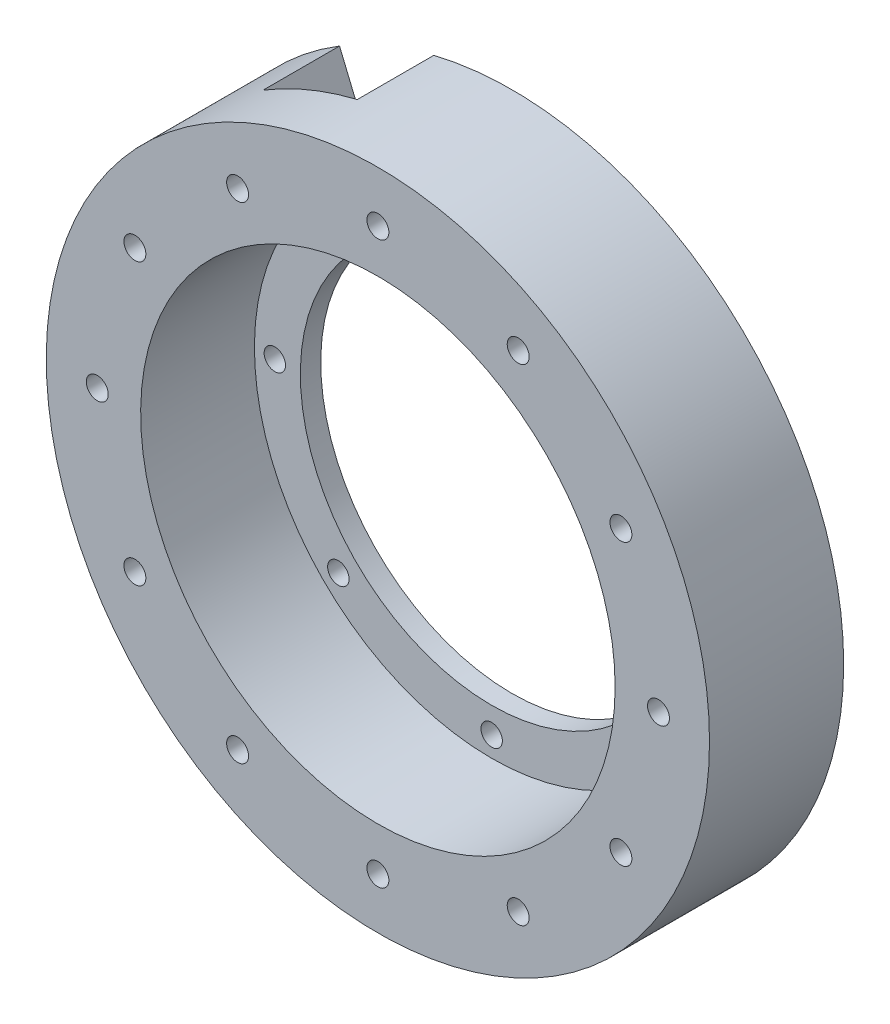
ISO-10303-21;
HEADER;
FILE_DESCRIPTION(('STEP AP214'),'2;1');
FILE_NAME('part.step','',(''),(''),'','','');
FILE_SCHEMA(('AUTOMOTIVE_DESIGN { 1 0 10303 214 1 1 1 1 }'));
ENDSEC;
DATA;
#1=APPLICATION_CONTEXT('core data for automotive mechanical design processes');
#2=APPLICATION_PROTOCOL_DEFINITION('international standard','automotive_design',2000,#1);
#3=PRODUCT_CONTEXT('',#1,'mechanical');
#4=PRODUCT('Part','Part','',(#3));
#5=PRODUCT_RELATED_PRODUCT_CATEGORY('part','',(#4));
#6=PRODUCT_DEFINITION_FORMATION('','',#4);
#7=PRODUCT_DEFINITION_CONTEXT('part definition',#1,'design');
#8=PRODUCT_DEFINITION('design','',#6,#7);
#9=PRODUCT_DEFINITION_SHAPE('','',#8);
#10=(LENGTH_UNIT() NAMED_UNIT(*) SI_UNIT(.MILLI.,.METRE.));
#11=(NAMED_UNIT(*) PLANE_ANGLE_UNIT() SI_UNIT($,.RADIAN.));
#12=(NAMED_UNIT(*) SI_UNIT($,.STERADIAN.) SOLID_ANGLE_UNIT());
#13=UNCERTAINTY_MEASURE_WITH_UNIT(LENGTH_MEASURE(1.E-05),#10,'distance_accuracy_value','');
#14=(GEOMETRIC_REPRESENTATION_CONTEXT(3) GLOBAL_UNCERTAINTY_ASSIGNED_CONTEXT((#13)) GLOBAL_UNIT_ASSIGNED_CONTEXT((#10,
#11,#12)) REPRESENTATION_CONTEXT('',''));
#15=CARTESIAN_POINT('',(0.,0.,0.));
#16=DIRECTION('',(0.,0.,1.));
#17=DIRECTION('',(1.,0.,0.));
#18=AXIS2_PLACEMENT_3D('',#15,#16,#17);
#19=CARTESIAN_POINT('',(-30.0520382004276,30.0520382004266,-16.3));
#20=DIRECTION('',(0.,0.,1.));
#21=DIRECTION('',(1.,0.,0.));
#22=AXIS2_PLACEMENT_3D('',#19,#20,#21);
#23=CYLINDRICAL_SURFACE('',#22,2.10000000000167);
#24=CARTESIAN_POINT('',(-30.0520382004276,30.0520382004266,0.));
#25=DIRECTION('',(0.,0.,1.));
#26=DIRECTION('',(1.,0.,0.));
#27=AXIS2_PLACEMENT_3D('',#24,#25,#26);
#28=CIRCLE('',#27,2.10000000000167);
#29=CARTESIAN_POINT('',(-27.9520382004259,30.0520382004266,0.));
#30=VERTEX_POINT('',#29);
#31=EDGE_CURVE('E142',#30,#30,#28,.T.);
#32=ORIENTED_EDGE('',*,*,#31,.F.);
#33=EDGE_LOOP('',(#32));
#34=FACE_BOUND('',#33,.T.);
#35=CARTESIAN_POINT('',(-30.0520382004276,30.0520382004266,4.));
#36=DIRECTION('',(0.,0.,1.));
#37=DIRECTION('',(1.,0.,0.));
#38=AXIS2_PLACEMENT_3D('',#35,#36,#37);
#39=CIRCLE('',#38,2.10000000000167);
#40=CARTESIAN_POINT('',(-27.9520382004259,30.0520382004266,4.));
#41=VERTEX_POINT('',#40);
#42=EDGE_CURVE('E220',#41,#41,#39,.F.);
#43=ORIENTED_EDGE('',*,*,#42,.F.);
#44=EDGE_LOOP('',(#43));
#45=FACE_BOUND('',#44,.T.);
#46=ADVANCED_FACE('F34',(#34,#45),#23,.F.);
#47=CARTESIAN_POINT('',(-42.4999999999976,-2.41324292713615E-12,-16.3));
#48=DIRECTION('',(0.,0.,1.));
#49=DIRECTION('',(1.,0.,0.));
#50=AXIS2_PLACEMENT_3D('',#47,#48,#49);
#51=CYLINDRICAL_SURFACE('',#50,2.10000000000344);
#52=CARTESIAN_POINT('',(-42.4999999999976,-2.41324292713615E-12,0.));
#53=DIRECTION('',(0.,0.,1.));
#54=DIRECTION('',(1.,0.,0.));
#55=AXIS2_PLACEMENT_3D('',#52,#53,#54);
#56=CIRCLE('',#55,2.10000000000344);
#57=CARTESIAN_POINT('',(-40.3999999999942,-2.41324292713615E-12,0.));
#58=VERTEX_POINT('',#57);
#59=EDGE_CURVE('E139',#58,#58,#56,.T.);
#60=ORIENTED_EDGE('',*,*,#59,.F.);
#61=EDGE_LOOP('',(#60));
#62=FACE_BOUND('',#61,.T.);
#63=CARTESIAN_POINT('',(-42.4999999999976,-2.41324292713615E-12,4.));
#64=DIRECTION('',(0.,0.,1.));
#65=DIRECTION('',(1.,0.,0.));
#66=AXIS2_PLACEMENT_3D('',#63,#64,#65);
#67=CIRCLE('',#66,2.10000000000344);
#68=CARTESIAN_POINT('',(-40.3999999999942,-2.41324292713615E-12,4.));
#69=VERTEX_POINT('',#68);
#70=EDGE_CURVE('E238',#69,#69,#67,.F.);
#71=ORIENTED_EDGE('',*,*,#70,.F.);
#72=EDGE_LOOP('',(#71));
#73=FACE_BOUND('',#72,.T.);
#74=ADVANCED_FACE('F290',(#62,#73),#51,.F.);
#75=CARTESIAN_POINT('',(-30.0520382004242,-30.05203820043,-16.3));
#76=DIRECTION('',(0.,0.,1.));
#77=DIRECTION('',(1.,0.,0.));
#78=AXIS2_PLACEMENT_3D('',#75,#76,#77);
#79=CYLINDRICAL_SURFACE('',#78,2.10000000000478);
#80=CARTESIAN_POINT('',(-30.0520382004242,-30.05203820043,0.));
#81=DIRECTION('',(0.,0.,1.));
#82=DIRECTION('',(1.,0.,0.));
#83=AXIS2_PLACEMENT_3D('',#80,#81,#82);
#84=CIRCLE('',#83,2.10000000000478);
#85=CARTESIAN_POINT('',(-27.9520382004194,-30.05203820043,0.));
#86=VERTEX_POINT('',#85);
#87=EDGE_CURVE('E136',#86,#86,#84,.T.);
#88=ORIENTED_EDGE('',*,*,#87,.F.);
#89=EDGE_LOOP('',(#88));
#90=FACE_BOUND('',#89,.T.);
#91=CARTESIAN_POINT('',(-30.0520382004242,-30.05203820043,4.));
#92=DIRECTION('',(0.,0.,1.));
#93=DIRECTION('',(1.,0.,0.));
#94=AXIS2_PLACEMENT_3D('',#91,#92,#93);
#95=CIRCLE('',#94,2.10000000000478);
#96=CARTESIAN_POINT('',(-27.9520382004194,-30.05203820043,4.));
#97=VERTEX_POINT('',#96);
#98=EDGE_CURVE('E241',#97,#97,#95,.F.);
#99=ORIENTED_EDGE('',*,*,#98,.F.);
#100=EDGE_LOOP('',(#99));
#101=FACE_BOUND('',#100,.T.);
#102=ADVANCED_FACE('F296',(#90,#101),#79,.F.);
#103=CARTESIAN_POINT('',(4.81607635647955E-12,-42.5,-16.3));
#104=DIRECTION('',(0.,0.,1.));
#105=DIRECTION('',(1.,0.,0.));
#106=AXIS2_PLACEMENT_3D('',#103,#104,#105);
#107=CYLINDRICAL_SURFACE('',#106,2.10000000000489);
#108=CARTESIAN_POINT('',(4.81607635647955E-12,-42.5,0.));
#109=DIRECTION('',(0.,0.,1.));
#110=DIRECTION('',(1.,0.,0.));
#111=AXIS2_PLACEMENT_3D('',#108,#109,#110);
#112=CIRCLE('',#111,2.10000000000489);
#113=CARTESIAN_POINT('',(2.10000000000971,-42.5,0.));
#114=VERTEX_POINT('',#113);
#115=EDGE_CURVE('E133',#114,#114,#112,.T.);
#116=ORIENTED_EDGE('',*,*,#115,.F.);
#117=EDGE_LOOP('',(#116));
#118=FACE_BOUND('',#117,.T.);
#119=CARTESIAN_POINT('',(4.81607635647955E-12,-42.5,4.));
#120=DIRECTION('',(0.,0.,1.));
#121=DIRECTION('',(1.,0.,0.));
#122=AXIS2_PLACEMENT_3D('',#119,#120,#121);
#123=CIRCLE('',#122,2.10000000000489);
#124=CARTESIAN_POINT('',(2.10000000000971,-42.5,4.));
#125=VERTEX_POINT('',#124);
#126=EDGE_CURVE('E244',#125,#125,#123,.F.);
#127=ORIENTED_EDGE('',*,*,#126,.F.);
#128=EDGE_LOOP('',(#127));
#129=FACE_BOUND('',#128,.T.);
#130=ADVANCED_FACE('F304',(#118,#129),#107,.F.);
#131=CARTESIAN_POINT('',(30.0520382004324,-30.0520382004266,-16.3));
#132=DIRECTION('',(0.,0.,1.));
#133=DIRECTION('',(1.,0.,0.));
#134=AXIS2_PLACEMENT_3D('',#131,#132,#133);
#135=CYLINDRICAL_SURFACE('',#134,2.10000000000365);
#136=CARTESIAN_POINT('',(30.0520382004324,-30.0520382004266,0.));
#137=DIRECTION('',(0.,0.,1.));
#138=DIRECTION('',(1.,0.,0.));
#139=AXIS2_PLACEMENT_3D('',#136,#137,#138);
#140=CIRCLE('',#139,2.10000000000365);
#141=CARTESIAN_POINT('',(32.152038200436,-30.0520382004266,0.));
#142=VERTEX_POINT('',#141);
#143=EDGE_CURVE('E130',#142,#142,#140,.T.);
#144=ORIENTED_EDGE('',*,*,#143,.F.);
#145=EDGE_LOOP('',(#144));
#146=FACE_BOUND('',#145,.T.);
#147=CARTESIAN_POINT('',(30.0520382004324,-30.0520382004266,4.));
#148=DIRECTION('',(0.,0.,1.));
#149=DIRECTION('',(1.,0.,0.));
#150=AXIS2_PLACEMENT_3D('',#147,#148,#149);
#151=CIRCLE('',#150,2.10000000000365);
#152=CARTESIAN_POINT('',(32.152038200436,-30.0520382004266,4.));
#153=VERTEX_POINT('',#152);
#154=EDGE_CURVE('E247',#153,#153,#151,.F.);
#155=ORIENTED_EDGE('',*,*,#154,.F.);
#156=EDGE_LOOP('',(#155));
#157=FACE_BOUND('',#156,.T.);
#158=ADVANCED_FACE('F308',(#146,#157),#135,.F.);
#159=CARTESIAN_POINT('',(42.5000000000024,2.40803817823978E-12,-16.3));
#160=DIRECTION('',(0.,0.,1.));
#161=DIRECTION('',(1.,0.,0.));
#162=AXIS2_PLACEMENT_3D('',#159,#160,#161);
#163=CYLINDRICAL_SURFACE('',#162,2.10000000000174);
#164=CARTESIAN_POINT('',(42.5000000000024,2.40803817823978E-12,0.));
#165=DIRECTION('',(0.,0.,1.));
#166=DIRECTION('',(1.,0.,0.));
#167=AXIS2_PLACEMENT_3D('',#164,#165,#166);
#168=CIRCLE('',#167,2.10000000000174);
#169=CARTESIAN_POINT('',(44.6000000000042,2.40803817823978E-12,0.));
#170=VERTEX_POINT('',#169);
#171=EDGE_CURVE('E127',#170,#170,#168,.T.);
#172=ORIENTED_EDGE('',*,*,#171,.F.);
#173=EDGE_LOOP('',(#172));
#174=FACE_BOUND('',#173,.T.);
#175=CARTESIAN_POINT('',(42.5000000000024,2.40803817823978E-12,4.));
#176=DIRECTION('',(0.,0.,1.));
#177=DIRECTION('',(1.,0.,0.));
#178=AXIS2_PLACEMENT_3D('',#175,#176,#177);
#179=CIRCLE('',#178,2.10000000000174);
#180=CARTESIAN_POINT('',(44.6000000000042,2.40803817823978E-12,4.));
#181=VERTEX_POINT('',#180);
#182=EDGE_CURVE('E250',#181,#181,#179,.F.);
#183=ORIENTED_EDGE('',*,*,#182,.F.);
#184=EDGE_LOOP('',(#183));
#185=FACE_BOUND('',#184,.T.);
#186=ADVANCED_FACE('F312',(#174,#185),#163,.F.);
#187=CARTESIAN_POINT('',(30.052038200429,30.05203820043,-16.3));
#188=DIRECTION('',(0.,0.,1.));
#189=DIRECTION('',(1.,0.,0.));
#190=AXIS2_PLACEMENT_3D('',#187,#188,#189);
#191=CYLINDRICAL_SURFACE('',#190,2.10000000000024);
#192=CARTESIAN_POINT('',(30.052038200429,30.05203820043,0.));
#193=DIRECTION('',(0.,0.,1.));
#194=DIRECTION('',(1.,0.,0.));
#195=AXIS2_PLACEMENT_3D('',#192,#193,#194);
#196=CIRCLE('',#195,2.10000000000024);
#197=CARTESIAN_POINT('',(32.1520382004292,30.05203820043,0.));
#198=VERTEX_POINT('',#197);
#199=EDGE_CURVE('E124',#198,#198,#196,.T.);
#200=ORIENTED_EDGE('',*,*,#199,.F.);
#201=EDGE_LOOP('',(#200));
#202=FACE_BOUND('',#201,.T.);
#203=CARTESIAN_POINT('',(30.052038200429,30.05203820043,4.));
#204=DIRECTION('',(0.,0.,1.));
#205=DIRECTION('',(1.,0.,0.));
#206=AXIS2_PLACEMENT_3D('',#203,#204,#205);
#207=CIRCLE('',#206,2.10000000000024);
#208=CARTESIAN_POINT('',(32.1520382004292,30.05203820043,4.));
#209=VERTEX_POINT('',#208);
#210=EDGE_CURVE('E253',#209,#209,#207,.F.);
#211=ORIENTED_EDGE('',*,*,#210,.F.);
#212=EDGE_LOOP('',(#211));
#213=FACE_BOUND('',#212,.T.);
#214=ADVANCED_FACE('F316',(#202,#213),#191,.F.);
#215=CARTESIAN_POINT('',(0.,42.5,-16.3));
#216=DIRECTION('',(0.,0.,1.));
#217=DIRECTION('',(1.,0.,0.));
#218=AXIS2_PLACEMENT_3D('',#215,#216,#217);
#219=CYLINDRICAL_SURFACE('',#218,2.1);
#220=CARTESIAN_POINT('',(0.,42.5,0.));
#221=DIRECTION('',(0.,0.,1.));
#222=DIRECTION('',(1.,0.,0.));
#223=AXIS2_PLACEMENT_3D('',#220,#221,#222);
#224=CIRCLE('',#223,2.1);
#225=CARTESIAN_POINT('',(2.1,42.5,0.));
#226=VERTEX_POINT('',#225);
#227=EDGE_CURVE('E121',#226,#226,#224,.T.);
#228=ORIENTED_EDGE('',*,*,#227,.F.);
#229=EDGE_LOOP('',(#228));
#230=FACE_BOUND('',#229,.T.);
#231=CARTESIAN_POINT('',(0.,42.5,4.));
#232=DIRECTION('',(0.,0.,1.));
#233=DIRECTION('',(1.,0.,0.));
#234=AXIS2_PLACEMENT_3D('',#231,#232,#233);
#235=CIRCLE('',#234,2.1);
#236=CARTESIAN_POINT('',(2.1,42.5,4.));
#237=VERTEX_POINT('',#236);
#238=EDGE_CURVE('E256',#237,#237,#235,.F.);
#239=ORIENTED_EDGE('',*,*,#238,.F.);
#240=EDGE_LOOP('',(#239));
#241=FACE_BOUND('',#240,.T.);
#242=ADVANCED_FACE('F320',(#230,#241),#219,.F.);
#243=CARTESIAN_POINT('',(0.,0.,21.3));
#244=DIRECTION('',(0.,0.,-1.));
#245=DIRECTION('',(-1.,0.,0.));
#246=AXIS2_PLACEMENT_3D('',#243,#244,#245);
#247=CYLINDRICAL_SURFACE('',#246,37.5);
#248=CARTESIAN_POINT('',(0.,0.,4.));
#249=DIRECTION('',(0.,0.,-1.));
#250=DIRECTION('',(1.,0.,0.));
#251=AXIS2_PLACEMENT_3D('',#248,#249,#250);
#252=CIRCLE('',#251,37.5);
#253=CARTESIAN_POINT('',(-4.59218018414001,37.2177629789378,4.));
#254=VERTEX_POINT('',#253);
#255=CARTESIAN_POINT('',(-23.0697708343656,29.5640943316357,4.));
#256=VERTEX_POINT('',#255);
#257=EDGE_CURVE('E89',#254,#256,#252,.T.);
#258=ORIENTED_EDGE('',*,*,#257,.F.);
#259=DIRECTION('',(0.,0.,-1.));
#260=VECTOR('',#259,1.);
#261=CARTESIAN_POINT('',(-4.59218018414001,37.2177629789378,21.3));
#262=LINE('',#261,#260);
#263=CARTESIAN_POINT('',(-4.59218018414001,37.2177629789378,0.));
#264=VERTEX_POINT('',#263);
#265=EDGE_CURVE('E57',#254,#264,#262,.T.);
#266=ORIENTED_EDGE('',*,*,#265,.T.);
#267=CARTESIAN_POINT('',(0.,0.,0.));
#268=DIRECTION('',(0.,0.,-1.));
#269=DIRECTION('',(-1.,0.,0.));
#270=AXIS2_PLACEMENT_3D('',#267,#268,#269);
#271=CIRCLE('',#270,37.5);
#272=CARTESIAN_POINT('',(-23.0697708343656,29.5640943316357,0.));
#273=VERTEX_POINT('',#272);
#274=EDGE_CURVE('E108',#264,#273,#271,.T.);
#275=ORIENTED_EDGE('',*,*,#274,.T.);
#276=DIRECTION('',(0.,0.,-1.));
#277=VECTOR('',#276,1.);
#278=CARTESIAN_POINT('',(-23.0697708343656,29.5640943316357,21.3));
#279=LINE('',#278,#277);
#280=EDGE_CURVE('E43',#273,#256,#279,.F.);
#281=ORIENTED_EDGE('',*,*,#280,.T.);
#282=EDGE_LOOP('',(#258,#266,#275,#281));
#283=FACE_BOUND('',#282,.T.);
#284=ADVANCED_FACE('F106',(#283),#247,.F.);
#285=CARTESIAN_POINT('',(0.,0.,5.));
#286=DIRECTION('',(0.,0.,-1.));
#287=DIRECTION('',(-1.,0.,0.));
#288=AXIS2_PLACEMENT_3D('',#285,#286,#287);
#289=CYLINDRICAL_SURFACE('',#288,65.);
#290=CARTESIAN_POINT('',(0.,0.,15.));
#291=DIRECTION('',(0.,0.,-1.));
#292=DIRECTION('',(-1.,0.,0.));
#293=AXIS2_PLACEMENT_3D('',#290,#291,#292);
#294=CIRCLE('',#293,65.);
#295=CARTESIAN_POINT('',(-33.817083788771,55.510403025228,15.));
#296=VERTEX_POINT('',#295);
#297=CARTESIAN_POINT('',(-15.3394931385454,63.1640716725301,15.));
#298=VERTEX_POINT('',#297);
#299=EDGE_CURVE('E146',#296,#298,#294,.T.);
#300=ORIENTED_EDGE('',*,*,#299,.F.);
#301=DIRECTION('',(0.,0.,-1.));
#302=VECTOR('',#301,1.);
#303=CARTESIAN_POINT('',(-33.817083788771,55.510403025228,5.));
#304=LINE('',#303,#302);
#305=CARTESIAN_POINT('',(-33.817083788771,55.510403025228,0.));
#306=VERTEX_POINT('',#305);
#307=EDGE_CURVE('E148',#296,#306,#304,.T.);
#308=ORIENTED_EDGE('',*,*,#307,.T.);
#309=CARTESIAN_POINT('',(0.,0.,0.));
#310=DIRECTION('',(0.,0.,1.));
#311=DIRECTION('',(1.,0.,0.));
#312=AXIS2_PLACEMENT_3D('',#309,#310,#311);
#313=CIRCLE('',#312,65.);
#314=CARTESIAN_POINT('',(-15.3394931385454,63.1640716725301,0.));
#315=VERTEX_POINT('',#314);
#316=EDGE_CURVE('E110',#306,#315,#313,.T.);
#317=ORIENTED_EDGE('',*,*,#316,.T.);
#318=DIRECTION('',(0.,0.,-1.));
#319=VECTOR('',#318,1.);
#320=CARTESIAN_POINT('',(-15.3394931385454,63.1640716725301,5.));
#321=LINE('',#320,#319);
#322=EDGE_CURVE('E152',#315,#298,#321,.F.);
#323=ORIENTED_EDGE('',*,*,#322,.T.);
#324=EDGE_LOOP('',(#300,#308,#317,#323));
#325=FACE_BOUND('',#324,.T.);
#326=CARTESIAN_POINT('',(0.,0.,26.3));
#327=DIRECTION('',(0.,0.,1.));
#328=DIRECTION('',(1.,0.,0.));
#329=AXIS2_PLACEMENT_3D('',#326,#327,#328);
#330=CIRCLE('',#329,65.);
#331=CARTESIAN_POINT('',(65.,0.,26.3));
#332=VERTEX_POINT('',#331);
#333=EDGE_CURVE('E115',#332,#332,#330,.T.);
#334=ORIENTED_EDGE('',*,*,#333,.F.);
#335=EDGE_LOOP('',(#334));
#336=FACE_BOUND('',#335,.T.);
#337=ADVANCED_FACE('F36',(#325,#336),#289,.T.);
#338=CARTESIAN_POINT('',(0.,0.,0.));
#339=DIRECTION('',(0.,0.,1.));
#340=DIRECTION('',(1.,0.,0.));
#341=AXIS2_PLACEMENT_3D('',#338,#339,#340);
#342=PLANE('',#341);
#343=CARTESIAN_POINT('',(0.,55.,0.));
#344=DIRECTION('',(0.,0.,1.));
#345=DIRECTION('',(1.,0.,0.));
#346=AXIS2_PLACEMENT_3D('',#343,#344,#345);
#347=CIRCLE('',#346,2.15);
#348=CARTESIAN_POINT('',(2.15,55.,0.));
#349=VERTEX_POINT('',#348);
#350=EDGE_CURVE('E189',#349,#349,#347,.T.);
#351=ORIENTED_EDGE('',*,*,#350,.T.);
#352=EDGE_LOOP('',(#351));
#353=FACE_BOUND('',#352,.T.);
#354=CARTESIAN_POINT('',(-47.631397208143,27.4999999999979,0.));
#355=DIRECTION('',(0.,0.,1.));
#356=DIRECTION('',(1.,0.,0.));
#357=AXIS2_PLACEMENT_3D('',#354,#355,#356);
#358=CIRCLE('',#357,2.15000000000237);
#359=CARTESIAN_POINT('',(-45.4813972081406,27.4999999999979,0.));
#360=VERTEX_POINT('',#359);
#361=EDGE_CURVE('E219',#360,#360,#358,.T.);
#362=ORIENTED_EDGE('',*,*,#361,.T.);
#363=EDGE_LOOP('',(#362));
#364=FACE_BOUND('',#363,.T.);
#365=CARTESIAN_POINT('',(-54.9999999999977,-2.34142324931068E-12,0.));
#366=DIRECTION('',(0.,0.,1.));
#367=DIRECTION('',(1.,0.,0.));
#368=AXIS2_PLACEMENT_3D('',#365,#366,#367);
#369=CIRCLE('',#368,2.15000000000347);
#370=CARTESIAN_POINT('',(-52.8499999999942,-2.34142324931068E-12,0.));
#371=VERTEX_POINT('',#370);
#372=EDGE_CURVE('E224',#371,#371,#369,.T.);
#373=ORIENTED_EDGE('',*,*,#372,.T.);
#374=EDGE_LOOP('',(#373));
#375=FACE_BOUND('',#374,.T.);
#376=CARTESIAN_POINT('',(27.5000000000001,47.6313972081441,0.));
#377=DIRECTION('',(0.,0.,1.));
#378=DIRECTION('',(1.,0.,0.));
#379=AXIS2_PLACEMENT_3D('',#376,#377,#378);
#380=CIRCLE('',#379,2.15);
#381=CARTESIAN_POINT('',(29.6500000000001,47.6313972081441,0.));
#382=VERTEX_POINT('',#381);
#383=EDGE_CURVE('E183',#382,#382,#380,.T.);
#384=ORIENTED_EDGE('',*,*,#383,.T.);
#385=EDGE_LOOP('',(#384));
#386=FACE_BOUND('',#385,.T.);
#387=CARTESIAN_POINT('',(47.6313972081453,27.500000000002,0.));
#388=DIRECTION('',(0.,0.,1.));
#389=DIRECTION('',(1.,0.,0.));
#390=AXIS2_PLACEMENT_3D('',#387,#388,#389);
#391=CIRCLE('',#390,2.15000000000064);
#392=CARTESIAN_POINT('',(49.7813972081459,27.500000000002,0.));
#393=VERTEX_POINT('',#392);
#394=EDGE_CURVE('E177',#393,#393,#391,.T.);
#395=ORIENTED_EDGE('',*,*,#394,.T.);
#396=EDGE_LOOP('',(#395));
#397=FACE_BOUND('',#396,.T.);
#398=CARTESIAN_POINT('',(55.0000000000023,2.33468769191537E-12,0.));
#399=DIRECTION('',(0.,0.,1.));
#400=DIRECTION('',(1.,0.,0.));
#401=AXIS2_PLACEMENT_3D('',#398,#399,#400);
#402=CIRCLE('',#401,2.15000000000173);
#403=CARTESIAN_POINT('',(57.1500000000041,2.33468769191537E-12,0.));
#404=VERTEX_POINT('',#403);
#405=EDGE_CURVE('E169',#404,#404,#402,.T.);
#406=ORIENTED_EDGE('',*,*,#405,.T.);
#407=EDGE_LOOP('',(#406));
#408=FACE_BOUND('',#407,.T.);
#409=CARTESIAN_POINT('',(47.6313972081476,-27.499999999998,0.));
#410=DIRECTION('',(0.,0.,1.));
#411=DIRECTION('',(1.,0.,0.));
#412=AXIS2_PLACEMENT_3D('',#409,#410,#411);
#413=CIRCLE('',#412,2.15000000000301);
#414=CARTESIAN_POINT('',(49.7813972081506,-27.499999999998,0.));
#415=VERTEX_POINT('',#414);
#416=EDGE_CURVE('E170',#415,#415,#413,.T.);
#417=ORIENTED_EDGE('',*,*,#416,.T.);
#418=EDGE_LOOP('',(#417));
#419=FACE_BOUND('',#418,.T.);
#420=CARTESIAN_POINT('',(27.5000000000044,-47.6313972081429,0.));
#421=DIRECTION('',(0.,0.,1.));
#422=DIRECTION('',(1.,0.,0.));
#423=AXIS2_PLACEMENT_3D('',#420,#421,#422);
#424=CIRCLE('',#423,2.15000000000414);
#425=CARTESIAN_POINT('',(29.6500000000085,-47.6313972081429,0.));
#426=VERTEX_POINT('',#425);
#427=EDGE_CURVE('E209',#426,#426,#424,.T.);
#428=ORIENTED_EDGE('',*,*,#427,.T.);
#429=EDGE_LOOP('',(#428));
#430=FACE_BOUND('',#429,.T.);
#431=CARTESIAN_POINT('',(4.66937538383073E-12,-55.,0.));
#432=DIRECTION('',(0.,0.,1.));
#433=DIRECTION('',(1.,0.,0.));
#434=AXIS2_PLACEMENT_3D('',#431,#432,#433);
#435=CIRCLE('',#434,2.15000000000483);
#436=CARTESIAN_POINT('',(2.1500000000095,-55.,0.));
#437=VERTEX_POINT('',#436);
#438=EDGE_CURVE('E203',#437,#437,#435,.T.);
#439=ORIENTED_EDGE('',*,*,#438,.T.);
#440=EDGE_LOOP('',(#439));
#441=FACE_BOUND('',#440,.T.);
#442=CARTESIAN_POINT('',(-27.4999999999956,-47.6313972081453,0.));
#443=DIRECTION('',(0.,0.,1.));
#444=DIRECTION('',(1.,0.,0.));
#445=AXIS2_PLACEMENT_3D('',#442,#443,#444);
#446=CIRCLE('',#445,2.15000000000495);
#447=CARTESIAN_POINT('',(-25.3499999999907,-47.6313972081453,0.));
#448=VERTEX_POINT('',#447);
#449=EDGE_CURVE('E195',#448,#448,#446,.T.);
#450=ORIENTED_EDGE('',*,*,#449,.T.);
#451=EDGE_LOOP('',(#450));
#452=FACE_BOUND('',#451,.T.);
#453=CARTESIAN_POINT('',(-47.6313972081406,-27.500000000002,0.));
#454=DIRECTION('',(0.,0.,1.));
#455=DIRECTION('',(1.,0.,0.));
#456=AXIS2_PLACEMENT_3D('',#453,#454,#455);
#457=CIRCLE('',#456,2.15000000000445);
#458=CARTESIAN_POINT('',(-45.4813972081362,-27.500000000002,0.));
#459=VERTEX_POINT('',#458);
#460=EDGE_CURVE('E196',#459,#459,#457,.T.);
#461=ORIENTED_EDGE('',*,*,#460,.T.);
#462=EDGE_LOOP('',(#461));
#463=FACE_BOUND('',#462,.T.);
#464=ORIENTED_EDGE('',*,*,#316,.F.);
#465=DIRECTION('',(-0.382683432365104,0.923879532511281,0.));
#466=VECTOR('',#465,1.);
#467=CARTESIAN_POINT('',(-34.4495589843774,57.0373332203255,0.));
#468=LINE('',#467,#466);
#469=EDGE_CURVE('E157',#273,#306,#468,.T.);
#470=ORIENTED_EDGE('',*,*,#469,.F.);
#471=ORIENTED_EDGE('',*,*,#274,.F.);
#472=DIRECTION('',(0.382683432365104,-0.923879532511281,0.));
#473=VECTOR('',#472,1.);
#474=CARTESIAN_POINT('',(-15.9719683341518,64.6910018676276,0.));
#475=LINE('',#474,#473);
#476=EDGE_CURVE('E160',#315,#264,#475,.T.);
#477=ORIENTED_EDGE('',*,*,#476,.F.);
#478=EDGE_LOOP('',(#464,#470,#471,#477));
#479=FACE_BOUND('',#478,.T.);
#480=ORIENTED_EDGE('',*,*,#227,.T.);
#481=EDGE_LOOP('',(#480));
#482=FACE_BOUND('',#481,.T.);
#483=ORIENTED_EDGE('',*,*,#199,.T.);
#484=EDGE_LOOP('',(#483));
#485=FACE_BOUND('',#484,.T.);
#486=ORIENTED_EDGE('',*,*,#171,.T.);
#487=EDGE_LOOP('',(#486));
#488=FACE_BOUND('',#487,.T.);
#489=ORIENTED_EDGE('',*,*,#143,.T.);
#490=EDGE_LOOP('',(#489));
#491=FACE_BOUND('',#490,.T.);
#492=ORIENTED_EDGE('',*,*,#115,.T.);
#493=EDGE_LOOP('',(#492));
#494=FACE_BOUND('',#493,.T.);
#495=ORIENTED_EDGE('',*,*,#87,.T.);
#496=EDGE_LOOP('',(#495));
#497=FACE_BOUND('',#496,.T.);
#498=ORIENTED_EDGE('',*,*,#59,.T.);
#499=EDGE_LOOP('',(#498));
#500=FACE_BOUND('',#499,.T.);
#501=ORIENTED_EDGE('',*,*,#31,.T.);
#502=EDGE_LOOP('',(#501));
#503=FACE_BOUND('',#502,.T.);
#504=ADVANCED_FACE('F266',(#353,#364,#375,#386,#397,#408,#419,#430,#441,#452,#463,#479,#482,
#485,#488,#491,#494,#497,#500,#503),#342,.F.);
#505=CARTESIAN_POINT('',(0.,0.,26.3));
#506=DIRECTION('',(0.,0.,1.));
#507=DIRECTION('',(1.,0.,0.));
#508=AXIS2_PLACEMENT_3D('',#505,#506,#507);
#509=PLANE('',#508);
#510=CARTESIAN_POINT('',(0.,55.,26.3));
#511=DIRECTION('',(0.,0.,1.));
#512=DIRECTION('',(1.,0.,0.));
#513=AXIS2_PLACEMENT_3D('',#510,#511,#512);
#514=CIRCLE('',#513,2.15);
#515=CARTESIAN_POINT('',(2.15,55.,26.3));
#516=VERTEX_POINT('',#515);
#517=EDGE_CURVE('E231',#516,#516,#514,.T.);
#518=ORIENTED_EDGE('',*,*,#517,.F.);
#519=EDGE_LOOP('',(#518));
#520=FACE_BOUND('',#519,.T.);
#521=CARTESIAN_POINT('',(-27.4999999999997,47.6313972081429,26.3));
#522=DIRECTION('',(0.,0.,1.));
#523=DIRECTION('',(1.,0.,0.));
#524=AXIS2_PLACEMENT_3D('',#521,#522,#523);
#525=CIRCLE('',#524,2.15000000000135);
#526=CARTESIAN_POINT('',(-25.3499999999984,47.6313972081429,26.3));
#527=VERTEX_POINT('',#526);
#528=EDGE_CURVE('E216',#527,#527,#525,.T.);
#529=ORIENTED_EDGE('',*,*,#528,.F.);
#530=EDGE_LOOP('',(#529));
#531=FACE_BOUND('',#530,.T.);
#532=CARTESIAN_POINT('',(-47.631397208143,27.4999999999979,26.3));
#533=DIRECTION('',(0.,0.,1.));
#534=DIRECTION('',(1.,0.,0.));
#535=AXIS2_PLACEMENT_3D('',#532,#533,#534);
#536=CIRCLE('',#535,2.15000000000237);
#537=CARTESIAN_POINT('',(-45.4813972081406,27.4999999999979,26.3));
#538=VERTEX_POINT('',#537);
#539=EDGE_CURVE('E221',#538,#538,#536,.T.);
#540=ORIENTED_EDGE('',*,*,#539,.F.);
#541=EDGE_LOOP('',(#540));
#542=FACE_BOUND('',#541,.T.);
#543=CARTESIAN_POINT('',(-54.9999999999977,-2.34142324931068E-12,26.3));
#544=DIRECTION('',(0.,0.,1.));
#545=DIRECTION('',(1.,0.,0.));
#546=AXIS2_PLACEMENT_3D('',#543,#544,#545);
#547=CIRCLE('',#546,2.15000000000347);
#548=CARTESIAN_POINT('',(-52.8499999999942,-2.34142324931068E-12,26.3));
#549=VERTEX_POINT('',#548);
#550=EDGE_CURVE('E199',#549,#549,#547,.T.);
#551=ORIENTED_EDGE('',*,*,#550,.F.);
#552=EDGE_LOOP('',(#551));
#553=FACE_BOUND('',#552,.T.);
#554=CARTESIAN_POINT('',(27.5000000000001,47.6313972081441,26.3));
#555=DIRECTION('',(0.,0.,1.));
#556=DIRECTION('',(1.,0.,0.));
#557=AXIS2_PLACEMENT_3D('',#554,#555,#556);
#558=CIRCLE('',#557,2.15);
#559=CARTESIAN_POINT('',(29.6500000000001,47.6313972081441,26.3));
#560=VERTEX_POINT('',#559);
#561=EDGE_CURVE('E186',#560,#560,#558,.T.);
#562=ORIENTED_EDGE('',*,*,#561,.F.);
#563=EDGE_LOOP('',(#562));
#564=FACE_BOUND('',#563,.T.);
#565=CARTESIAN_POINT('',(47.6313972081453,27.500000000002,26.3));
#566=DIRECTION('',(0.,0.,1.));
#567=DIRECTION('',(1.,0.,0.));
#568=AXIS2_PLACEMENT_3D('',#565,#566,#567);
#569=CIRCLE('',#568,2.15000000000064);
#570=CARTESIAN_POINT('',(49.7813972081459,27.500000000002,26.3));
#571=VERTEX_POINT('',#570);
#572=EDGE_CURVE('E180',#571,#571,#569,.T.);
#573=ORIENTED_EDGE('',*,*,#572,.F.);
#574=EDGE_LOOP('',(#573));
#575=FACE_BOUND('',#574,.T.);
#576=CARTESIAN_POINT('',(55.0000000000023,2.33468769191537E-12,26.3));
#577=DIRECTION('',(0.,0.,1.));
#578=DIRECTION('',(1.,0.,0.));
#579=AXIS2_PLACEMENT_3D('',#576,#577,#578);
#580=CIRCLE('',#579,2.15000000000173);
#581=CARTESIAN_POINT('',(57.1500000000041,2.33468769191537E-12,26.3));
#582=VERTEX_POINT('',#581);
#583=EDGE_CURVE('E174',#582,#582,#580,.T.);
#584=ORIENTED_EDGE('',*,*,#583,.F.);
#585=EDGE_LOOP('',(#584));
#586=FACE_BOUND('',#585,.T.);
#587=CARTESIAN_POINT('',(47.6313972081476,-27.499999999998,26.3));
#588=DIRECTION('',(0.,0.,1.));
#589=DIRECTION('',(1.,0.,0.));
#590=AXIS2_PLACEMENT_3D('',#587,#588,#589);
#591=CIRCLE('',#590,2.15000000000301);
#592=CARTESIAN_POINT('',(49.7813972081506,-27.499999999998,26.3));
#593=VERTEX_POINT('',#592);
#594=EDGE_CURVE('E166',#593,#593,#591,.T.);
#595=ORIENTED_EDGE('',*,*,#594,.F.);
#596=EDGE_LOOP('',(#595));
#597=FACE_BOUND('',#596,.T.);
#598=CARTESIAN_POINT('',(27.5000000000044,-47.6313972081429,26.3));
#599=DIRECTION('',(0.,0.,1.));
#600=DIRECTION('',(1.,0.,0.));
#601=AXIS2_PLACEMENT_3D('',#598,#599,#600);
#602=CIRCLE('',#601,2.15000000000414);
#603=CARTESIAN_POINT('',(29.6500000000085,-47.6313972081429,26.3));
#604=VERTEX_POINT('',#603);
#605=EDGE_CURVE('E173',#604,#604,#602,.T.);
#606=ORIENTED_EDGE('',*,*,#605,.F.);
#607=EDGE_LOOP('',(#606));
#608=FACE_BOUND('',#607,.T.);
#609=CARTESIAN_POINT('',(4.66937538383073E-12,-55.,26.3));
#610=DIRECTION('',(0.,0.,1.));
#611=DIRECTION('',(1.,0.,0.));
#612=AXIS2_PLACEMENT_3D('',#609,#610,#611);
#613=CIRCLE('',#612,2.15000000000483);
#614=CARTESIAN_POINT('',(2.1500000000095,-55.,26.3));
#615=VERTEX_POINT('',#614);
#616=EDGE_CURVE('E206',#615,#615,#613,.T.);
#617=ORIENTED_EDGE('',*,*,#616,.F.);
#618=EDGE_LOOP('',(#617));
#619=FACE_BOUND('',#618,.T.);
#620=CARTESIAN_POINT('',(-27.4999999999956,-47.6313972081453,26.3));
#621=DIRECTION('',(0.,0.,1.));
#622=DIRECTION('',(1.,0.,0.));
#623=AXIS2_PLACEMENT_3D('',#620,#621,#622);
#624=CIRCLE('',#623,2.15000000000495);
#625=CARTESIAN_POINT('',(-25.3499999999907,-47.6313972081453,26.3));
#626=VERTEX_POINT('',#625);
#627=EDGE_CURVE('E200',#626,#626,#624,.T.);
#628=ORIENTED_EDGE('',*,*,#627,.F.);
#629=EDGE_LOOP('',(#628));
#630=FACE_BOUND('',#629,.T.);
#631=CARTESIAN_POINT('',(-47.6313972081406,-27.500000000002,26.3));
#632=DIRECTION('',(0.,0.,1.));
#633=DIRECTION('',(1.,0.,0.));
#634=AXIS2_PLACEMENT_3D('',#631,#632,#633);
#635=CIRCLE('',#634,2.15000000000445);
#636=CARTESIAN_POINT('',(-45.4813972081362,-27.500000000002,26.3));
#637=VERTEX_POINT('',#636);
#638=EDGE_CURVE('E192',#637,#637,#635,.T.);
#639=ORIENTED_EDGE('',*,*,#638,.F.);
#640=EDGE_LOOP('',(#639));
#641=FACE_BOUND('',#640,.T.);
#642=ORIENTED_EDGE('',*,*,#333,.T.);
#643=EDGE_LOOP('',(#642));
#644=FACE_BOUND('',#643,.T.);
#645=CARTESIAN_POINT('',(0.,0.,26.3));
#646=DIRECTION('',(0.,0.,1.));
#647=DIRECTION('',(1.,0.,0.));
#648=AXIS2_PLACEMENT_3D('',#645,#646,#647);
#649=CIRCLE('',#648,46.5);
#650=CARTESIAN_POINT('',(46.5,0.,26.3));
#651=VERTEX_POINT('',#650);
#652=EDGE_CURVE('E118',#651,#651,#649,.T.);
#653=ORIENTED_EDGE('',*,*,#652,.F.);
#654=EDGE_LOOP('',(#653));
#655=FACE_BOUND('',#654,.T.);
#656=ADVANCED_FACE('F276',(#520,#531,#542,#553,#564,#575,#586,#597,#608,#619,#630,#641,#644,
#655),#509,.T.);
#657=CARTESIAN_POINT('',(0.,0.,26.3));
#658=DIRECTION('',(0.,0.,-1.));
#659=DIRECTION('',(-1.,0.,0.));
#660=AXIS2_PLACEMENT_3D('',#657,#658,#659);
#661=CYLINDRICAL_SURFACE('',#660,46.5);
#662=DIRECTION('',(0.,0.,-1.));
#663=VECTOR('',#662,1.);
#664=CARTESIAN_POINT('',(-26.617216434323,38.1283856108333,26.3));
#665=LINE('',#664,#663);
#666=CARTESIAN_POINT('',(-26.6172164343231,38.1283856108333,15.));
#667=VERTEX_POINT('',#666);
#668=CARTESIAN_POINT('',(-26.6172164343231,38.1283856108333,4.));
#669=VERTEX_POINT('',#668);
#670=EDGE_CURVE('E103',#667,#669,#665,.T.);
#671=ORIENTED_EDGE('',*,*,#670,.F.);
#672=CARTESIAN_POINT('',(0.,0.,15.));
#673=DIRECTION('',(0.,0.,-1.));
#674=DIRECTION('',(-1.,0.,0.));
#675=AXIS2_PLACEMENT_3D('',#672,#673,#674);
#676=CIRCLE('',#675,46.5);
#677=CARTESIAN_POINT('',(-8.13962578409745,45.7820542581354,15.));
#678=VERTEX_POINT('',#677);
#679=EDGE_CURVE('E11',#667,#678,#676,.T.);
#680=ORIENTED_EDGE('',*,*,#679,.T.);
#681=DIRECTION('',(0.,0.,-1.));
#682=VECTOR('',#681,1.);
#683=CARTESIAN_POINT('',(-8.13962578409745,45.7820542581354,26.3));
#684=LINE('',#683,#682);
#685=CARTESIAN_POINT('',(-8.13962578409745,45.7820542581354,4.));
#686=VERTEX_POINT('',#685);
#687=EDGE_CURVE('E49',#686,#678,#684,.F.);
#688=ORIENTED_EDGE('',*,*,#687,.F.);
#689=CARTESIAN_POINT('',(0.,0.,4.));
#690=DIRECTION('',(0.,0.,1.));
#691=DIRECTION('',(1.,0.,0.));
#692=AXIS2_PLACEMENT_3D('',#689,#690,#691);
#693=CIRCLE('',#692,46.5);
#694=EDGE_CURVE('E104',#669,#686,#693,.T.);
#695=ORIENTED_EDGE('',*,*,#694,.F.);
#696=EDGE_LOOP('',(#671,#680,#688,#695));
#697=FACE_BOUND('',#696,.T.);
#698=ORIENTED_EDGE('',*,*,#652,.T.);
#699=EDGE_LOOP('',(#698));
#700=FACE_BOUND('',#699,.T.);
#701=ADVANCED_FACE('F273',(#697,#700),#661,.F.);
#702=CARTESIAN_POINT('',(0.,0.,15.));
#703=DIRECTION('',(0.,0.,-1.));
#704=DIRECTION('',(-1.,0.,0.));
#705=AXIS2_PLACEMENT_3D('',#702,#703,#704);
#706=PLANE('',#705);
#707=CARTESIAN_POINT('',(-27.4999999999997,47.6313972081429,15.));
#708=DIRECTION('',(0.,0.,-1.));
#709=DIRECTION('',(-1.,0.,0.));
#710=AXIS2_PLACEMENT_3D('',#707,#708,#709);
#711=CIRCLE('',#710,2.15000000000135);
#712=CARTESIAN_POINT('',(-29.6500000000011,47.6313972081429,15.));
#713=VERTEX_POINT('',#712);
#714=EDGE_CURVE('E38',#713,#713,#711,.F.);
#715=ORIENTED_EDGE('',*,*,#714,.T.);
#716=EDGE_LOOP('',(#715));
#717=FACE_BOUND('',#716,.T.);
#718=ORIENTED_EDGE('',*,*,#299,.T.);
#719=DIRECTION('',(0.382683432365104,-0.923879532511281,0.));
#720=VECTOR('',#719,1.);
#721=CARTESIAN_POINT('',(-15.9719683341518,64.6910018676276,15.));
#722=LINE('',#721,#720);
#723=EDGE_CURVE('E159',#298,#678,#722,.T.);
#724=ORIENTED_EDGE('',*,*,#723,.T.);
#725=ORIENTED_EDGE('',*,*,#679,.F.);
#726=DIRECTION('',(-0.382683432365104,0.923879532511281,0.));
#727=VECTOR('',#726,1.);
#728=CARTESIAN_POINT('',(-34.4495589843774,57.0373332203255,15.));
#729=LINE('',#728,#727);
#730=EDGE_CURVE('E156',#667,#296,#729,.T.);
#731=ORIENTED_EDGE('',*,*,#730,.T.);
#732=EDGE_LOOP('',(#718,#724,#725,#731));
#733=FACE_BOUND('',#732,.T.);
#734=ADVANCED_FACE('F272',(#717,#733),#706,.T.);
#735=CARTESIAN_POINT('',(-34.4495589843774,57.0373332203255,15.));
#736=DIRECTION('',(-0.923879532511281,-0.382683432365104,0.));
#737=DIRECTION('',(0.382683432365104,-0.923879532511281,0.));
#738=AXIS2_PLACEMENT_3D('',#735,#736,#737);
#739=PLANE('',#738);
#740=ORIENTED_EDGE('',*,*,#670,.T.);
#741=DIRECTION('',(-0.382683432365105,0.923879532511281,0.));
#742=VECTOR('',#741,1.);
#743=CARTESIAN_POINT('',(-23.0697708343656,29.5640943316357,4.));
#744=LINE('',#743,#742);
#745=EDGE_CURVE('E93',#256,#669,#744,.T.);
#746=ORIENTED_EDGE('',*,*,#745,.F.);
#747=ORIENTED_EDGE('',*,*,#280,.F.);
#748=ORIENTED_EDGE('',*,*,#469,.T.);
#749=ORIENTED_EDGE('',*,*,#307,.F.);
#750=ORIENTED_EDGE('',*,*,#730,.F.);
#751=EDGE_LOOP('',(#740,#746,#747,#748,#749,#750));
#752=FACE_BOUND('',#751,.T.);
#753=ADVANCED_FACE('F99',(#752),#739,.F.);
#754=CARTESIAN_POINT('',(-15.9719683341518,64.6910018676276,15.));
#755=DIRECTION('',(0.923879532511281,0.382683432365104,0.));
#756=DIRECTION('',(-0.382683432365105,0.923879532511281,0.));
#757=AXIS2_PLACEMENT_3D('',#754,#755,#756);
#758=PLANE('',#757);
#759=DIRECTION('',(0.382683432365102,-0.923879532511282,0.));
#760=VECTOR('',#759,1.);
#761=CARTESIAN_POINT('',(-8.13962578409742,45.7820542581354,4.));
#762=LINE('',#761,#760);
#763=EDGE_CURVE('E95',#686,#254,#762,.T.);
#764=ORIENTED_EDGE('',*,*,#763,.F.);
#765=ORIENTED_EDGE('',*,*,#687,.T.);
#766=ORIENTED_EDGE('',*,*,#723,.F.);
#767=ORIENTED_EDGE('',*,*,#322,.F.);
#768=ORIENTED_EDGE('',*,*,#476,.T.);
#769=ORIENTED_EDGE('',*,*,#265,.F.);
#770=EDGE_LOOP('',(#764,#765,#766,#767,#768,#769));
#771=FACE_BOUND('',#770,.T.);
#772=ADVANCED_FACE('F261',(#771),#758,.F.);
#773=CARTESIAN_POINT('',(-27.4999999999997,47.6313972081429,26.3));
#774=DIRECTION('',(0.,0.,-1.));
#775=DIRECTION('',(-1.,0.,0.));
#776=AXIS2_PLACEMENT_3D('',#773,#774,#775);
#777=CYLINDRICAL_SURFACE('',#776,2.15000000000135);
#778=ORIENTED_EDGE('',*,*,#714,.F.);
#779=EDGE_LOOP('',(#778));
#780=FACE_BOUND('',#779,.T.);
#781=ORIENTED_EDGE('',*,*,#528,.T.);
#782=EDGE_LOOP('',(#781));
#783=FACE_BOUND('',#782,.T.);
#784=ADVANCED_FACE('F329',(#780,#783),#777,.F.);
#785=CARTESIAN_POINT('',(-47.6313972081406,-27.500000000002,26.3));
#786=DIRECTION('',(0.,0.,-1.));
#787=DIRECTION('',(-1.,0.,0.));
#788=AXIS2_PLACEMENT_3D('',#785,#786,#787);
#789=CYLINDRICAL_SURFACE('',#788,2.15000000000445);
#790=ORIENTED_EDGE('',*,*,#638,.T.);
#791=EDGE_LOOP('',(#790));
#792=FACE_BOUND('',#791,.T.);
#793=ORIENTED_EDGE('',*,*,#460,.F.);
#794=EDGE_LOOP('',(#793));
#795=FACE_BOUND('',#794,.T.);
#796=ADVANCED_FACE('F353',(#792,#795),#789,.F.);
#797=CARTESIAN_POINT('',(-27.4999999999956,-47.6313972081453,26.3));
#798=DIRECTION('',(0.,0.,-1.));
#799=DIRECTION('',(-1.,0.,0.));
#800=AXIS2_PLACEMENT_3D('',#797,#798,#799);
#801=CYLINDRICAL_SURFACE('',#800,2.15000000000495);
#802=ORIENTED_EDGE('',*,*,#627,.T.);
#803=EDGE_LOOP('',(#802));
#804=FACE_BOUND('',#803,.T.);
#805=ORIENTED_EDGE('',*,*,#449,.F.);
#806=EDGE_LOOP('',(#805));
#807=FACE_BOUND('',#806,.T.);
#808=ADVANCED_FACE('F356',(#804,#807),#801,.F.);
#809=CARTESIAN_POINT('',(4.66937538383073E-12,-55.,26.3));
#810=DIRECTION('',(0.,0.,-1.));
#811=DIRECTION('',(-1.,0.,0.));
#812=AXIS2_PLACEMENT_3D('',#809,#810,#811);
#813=CYLINDRICAL_SURFACE('',#812,2.15000000000483);
#814=ORIENTED_EDGE('',*,*,#616,.T.);
#815=EDGE_LOOP('',(#814));
#816=FACE_BOUND('',#815,.T.);
#817=ORIENTED_EDGE('',*,*,#438,.F.);
#818=EDGE_LOOP('',(#817));
#819=FACE_BOUND('',#818,.T.);
#820=ADVANCED_FACE('F360',(#816,#819),#813,.F.);
#821=CARTESIAN_POINT('',(27.5000000000044,-47.6313972081429,26.3));
#822=DIRECTION('',(0.,0.,-1.));
#823=DIRECTION('',(-1.,0.,0.));
#824=AXIS2_PLACEMENT_3D('',#821,#822,#823);
#825=CYLINDRICAL_SURFACE('',#824,2.15000000000414);
#826=ORIENTED_EDGE('',*,*,#605,.T.);
#827=EDGE_LOOP('',(#826));
#828=FACE_BOUND('',#827,.T.);
#829=ORIENTED_EDGE('',*,*,#427,.F.);
#830=EDGE_LOOP('',(#829));
#831=FACE_BOUND('',#830,.T.);
#832=ADVANCED_FACE('F339',(#828,#831),#825,.F.);
#833=CARTESIAN_POINT('',(47.6313972081476,-27.499999999998,26.3));
#834=DIRECTION('',(0.,0.,-1.));
#835=DIRECTION('',(-1.,0.,0.));
#836=AXIS2_PLACEMENT_3D('',#833,#834,#835);
#837=CYLINDRICAL_SURFACE('',#836,2.15000000000301);
#838=ORIENTED_EDGE('',*,*,#594,.T.);
#839=EDGE_LOOP('',(#838));
#840=FACE_BOUND('',#839,.T.);
#841=ORIENTED_EDGE('',*,*,#416,.F.);
#842=EDGE_LOOP('',(#841));
#843=FACE_BOUND('',#842,.T.);
#844=ADVANCED_FACE('F335',(#840,#843),#837,.F.);
#845=CARTESIAN_POINT('',(55.0000000000023,2.33468769191537E-12,26.3));
#846=DIRECTION('',(0.,0.,-1.));
#847=DIRECTION('',(-1.,0.,0.));
#848=AXIS2_PLACEMENT_3D('',#845,#846,#847);
#849=CYLINDRICAL_SURFACE('',#848,2.15000000000173);
#850=ORIENTED_EDGE('',*,*,#583,.T.);
#851=EDGE_LOOP('',(#850));
#852=FACE_BOUND('',#851,.T.);
#853=ORIENTED_EDGE('',*,*,#405,.F.);
#854=EDGE_LOOP('',(#853));
#855=FACE_BOUND('',#854,.T.);
#856=ADVANCED_FACE('F338',(#852,#855),#849,.F.);
#857=CARTESIAN_POINT('',(47.6313972081453,27.500000000002,26.3));
#858=DIRECTION('',(0.,0.,-1.));
#859=DIRECTION('',(-1.,0.,0.));
#860=AXIS2_PLACEMENT_3D('',#857,#858,#859);
#861=CYLINDRICAL_SURFACE('',#860,2.15000000000064);
#862=ORIENTED_EDGE('',*,*,#572,.T.);
#863=EDGE_LOOP('',(#862));
#864=FACE_BOUND('',#863,.T.);
#865=ORIENTED_EDGE('',*,*,#394,.F.);
#866=EDGE_LOOP('',(#865));
#867=FACE_BOUND('',#866,.T.);
#868=ADVANCED_FACE('F343',(#864,#867),#861,.F.);
#869=CARTESIAN_POINT('',(27.5000000000001,47.6313972081441,26.3));
#870=DIRECTION('',(0.,0.,-1.));
#871=DIRECTION('',(-1.,0.,0.));
#872=AXIS2_PLACEMENT_3D('',#869,#870,#871);
#873=CYLINDRICAL_SURFACE('',#872,2.15);
#874=ORIENTED_EDGE('',*,*,#561,.T.);
#875=EDGE_LOOP('',(#874));
#876=FACE_BOUND('',#875,.T.);
#877=ORIENTED_EDGE('',*,*,#383,.F.);
#878=EDGE_LOOP('',(#877));
#879=FACE_BOUND('',#878,.T.);
#880=ADVANCED_FACE('F347',(#876,#879),#873,.F.);
#881=CARTESIAN_POINT('',(-54.9999999999977,-2.34142324931068E-12,26.3));
#882=DIRECTION('',(0.,0.,-1.));
#883=DIRECTION('',(-1.,0.,0.));
#884=AXIS2_PLACEMENT_3D('',#881,#882,#883);
#885=CYLINDRICAL_SURFACE('',#884,2.15000000000347);
#886=ORIENTED_EDGE('',*,*,#550,.T.);
#887=EDGE_LOOP('',(#886));
#888=FACE_BOUND('',#887,.T.);
#889=ORIENTED_EDGE('',*,*,#372,.F.);
#890=EDGE_LOOP('',(#889));
#891=FACE_BOUND('',#890,.T.);
#892=ADVANCED_FACE('F351',(#888,#891),#885,.F.);
#893=CARTESIAN_POINT('',(-47.631397208143,27.4999999999979,26.3));
#894=DIRECTION('',(0.,0.,-1.));
#895=DIRECTION('',(-1.,0.,0.));
#896=AXIS2_PLACEMENT_3D('',#893,#894,#895);
#897=CYLINDRICAL_SURFACE('',#896,2.15000000000237);
#898=ORIENTED_EDGE('',*,*,#539,.T.);
#899=EDGE_LOOP('',(#898));
#900=FACE_BOUND('',#899,.T.);
#901=ORIENTED_EDGE('',*,*,#361,.F.);
#902=EDGE_LOOP('',(#901));
#903=FACE_BOUND('',#902,.T.);
#904=ADVANCED_FACE('F371',(#900,#903),#897,.F.);
#905=CARTESIAN_POINT('',(0.,55.,26.3));
#906=DIRECTION('',(0.,0.,-1.));
#907=DIRECTION('',(-1.,0.,0.));
#908=AXIS2_PLACEMENT_3D('',#905,#906,#907);
#909=CYLINDRICAL_SURFACE('',#908,2.15);
#910=ORIENTED_EDGE('',*,*,#517,.T.);
#911=EDGE_LOOP('',(#910));
#912=FACE_BOUND('',#911,.T.);
#913=ORIENTED_EDGE('',*,*,#350,.F.);
#914=EDGE_LOOP('',(#913));
#915=FACE_BOUND('',#914,.T.);
#916=ADVANCED_FACE('F374',(#912,#915),#909,.F.);
#917=CARTESIAN_POINT('',(0.,0.,4.));
#918=DIRECTION('',(0.,0.,1.));
#919=DIRECTION('',(1.,0.,0.));
#920=AXIS2_PLACEMENT_3D('',#917,#918,#919);
#921=PLANE('',#920);
#922=ORIENTED_EDGE('',*,*,#257,.T.);
#923=ORIENTED_EDGE('',*,*,#745,.T.);
#924=ORIENTED_EDGE('',*,*,#694,.T.);
#925=ORIENTED_EDGE('',*,*,#763,.T.);
#926=EDGE_LOOP('',(#922,#923,#924,#925));
#927=FACE_BOUND('',#926,.T.);
#928=ORIENTED_EDGE('',*,*,#238,.T.);
#929=EDGE_LOOP('',(#928));
#930=FACE_BOUND('',#929,.T.);
#931=ORIENTED_EDGE('',*,*,#210,.T.);
#932=EDGE_LOOP('',(#931));
#933=FACE_BOUND('',#932,.T.);
#934=ORIENTED_EDGE('',*,*,#182,.T.);
#935=EDGE_LOOP('',(#934));
#936=FACE_BOUND('',#935,.T.);
#937=ORIENTED_EDGE('',*,*,#154,.T.);
#938=EDGE_LOOP('',(#937));
#939=FACE_BOUND('',#938,.T.);
#940=ORIENTED_EDGE('',*,*,#126,.T.);
#941=EDGE_LOOP('',(#940));
#942=FACE_BOUND('',#941,.T.);
#943=ORIENTED_EDGE('',*,*,#98,.T.);
#944=EDGE_LOOP('',(#943));
#945=FACE_BOUND('',#944,.T.);
#946=ORIENTED_EDGE('',*,*,#70,.T.);
#947=EDGE_LOOP('',(#946));
#948=FACE_BOUND('',#947,.T.);
#949=ORIENTED_EDGE('',*,*,#42,.T.);
#950=EDGE_LOOP('',(#949));
#951=FACE_BOUND('',#950,.T.);
#952=ADVANCED_FACE('F91',(#927,#930,#933,#936,#939,#942,#945,#948,#951),#921,.T.);
#953=CLOSED_SHELL('',(#46,#74,#102,#130,#158,#186,#214,#242,#284,#337,#504,#656,#701,#734,#753,
#772,#784,#796,#808,#820,#832,#844,#856,#868,#880,#892,#904,#916,#952));
#954=MANIFOLD_SOLID_BREP('B2',#953);
#955=ADVANCED_BREP_SHAPE_REPRESENTATION('',(#18,#954),#14);
#956=SHAPE_DEFINITION_REPRESENTATION(#9,#955);
ENDSEC;
END-ISO-10303-21;
